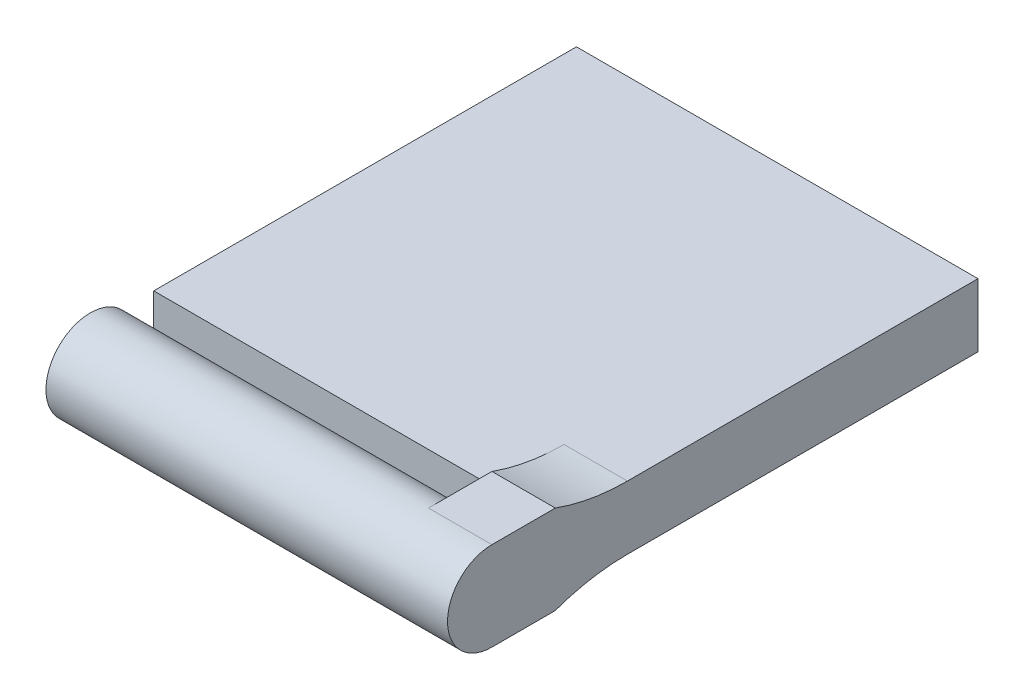
ISO-10303-21;
HEADER;
FILE_DESCRIPTION(('STEP AP214'),'2;1');
FILE_NAME('part.step','',(''),(''),'','','');
FILE_SCHEMA(('AUTOMOTIVE_DESIGN { 1 0 10303 214 1 1 1 1 }'));
ENDSEC;
DATA;
#1=APPLICATION_CONTEXT('core data for automotive mechanical design processes');
#2=APPLICATION_PROTOCOL_DEFINITION('international standard','automotive_design',2000,#1);
#3=PRODUCT_CONTEXT('',#1,'mechanical');
#4=PRODUCT('Part','Part','',(#3));
#5=PRODUCT_RELATED_PRODUCT_CATEGORY('part','',(#4));
#6=PRODUCT_DEFINITION_FORMATION('','',#4);
#7=PRODUCT_DEFINITION_CONTEXT('part definition',#1,'design');
#8=PRODUCT_DEFINITION('design','',#6,#7);
#9=PRODUCT_DEFINITION_SHAPE('','',#8);
#10=(LENGTH_UNIT() NAMED_UNIT(*) SI_UNIT(.MILLI.,.METRE.));
#11=(NAMED_UNIT(*) PLANE_ANGLE_UNIT() SI_UNIT($,.RADIAN.));
#12=(NAMED_UNIT(*) SI_UNIT($,.STERADIAN.) SOLID_ANGLE_UNIT());
#13=UNCERTAINTY_MEASURE_WITH_UNIT(LENGTH_MEASURE(1.E-05),#10,'distance_accuracy_value','');
#14=(GEOMETRIC_REPRESENTATION_CONTEXT(3) GLOBAL_UNCERTAINTY_ASSIGNED_CONTEXT((#13)) GLOBAL_UNIT_ASSIGNED_CONTEXT((#10,
#11,#12)) REPRESENTATION_CONTEXT('',''));
#15=CARTESIAN_POINT('',(0.,0.,0.));
#16=DIRECTION('',(0.,0.,1.));
#17=DIRECTION('',(1.,0.,0.));
#18=AXIS2_PLACEMENT_3D('',#15,#16,#17);
#19=CARTESIAN_POINT('',(16.,0.,0.));
#20=DIRECTION('',(-1.,0.,0.));
#21=DIRECTION('',(0.,0.,1.));
#22=AXIS2_PLACEMENT_3D('',#19,#20,#21);
#23=CYLINDRICAL_SURFACE('',#22,2.1);
#24=CARTESIAN_POINT('',(16.,0.,0.));
#25=DIRECTION('',(1.,0.,0.));
#26=DIRECTION('',(0.,0.,-1.));
#27=AXIS2_PLACEMENT_3D('',#24,#25,#26);
#28=CIRCLE('',#27,2.1);
#29=CARTESIAN_POINT('',(16.,-2.1,0.));
#30=VERTEX_POINT('',#29);
#31=CARTESIAN_POINT('',(16.,2.1,0.));
#32=VERTEX_POINT('',#31);
#33=EDGE_CURVE('E201',#30,#32,#28,.T.);
#34=ORIENTED_EDGE('',*,*,#33,.F.);
#35=DIRECTION('',(-1.,0.,0.));
#36=VECTOR('',#35,1.);
#37=CARTESIAN_POINT('',(19.,-2.1,0.));
#38=LINE('',#37,#36);
#39=CARTESIAN_POINT('',(19.,-2.1,0.));
#40=VERTEX_POINT('',#39);
#41=EDGE_CURVE('E196',#40,#30,#38,.T.);
#42=ORIENTED_EDGE('',*,*,#41,.F.);
#43=CARTESIAN_POINT('',(19.,0.,0.));
#44=DIRECTION('',(1.,0.,0.));
#45=DIRECTION('',(0.,0.,-1.));
#46=AXIS2_PLACEMENT_3D('',#43,#44,#45);
#47=CIRCLE('',#46,2.1);
#48=CARTESIAN_POINT('',(19.,2.1,0.));
#49=VERTEX_POINT('',#48);
#50=EDGE_CURVE('E165',#49,#40,#47,.T.);
#51=ORIENTED_EDGE('',*,*,#50,.F.);
#52=DIRECTION('',(-1.,0.,0.));
#53=VECTOR('',#52,1.);
#54=CARTESIAN_POINT('',(19.,2.1,0.));
#55=LINE('',#54,#53);
#56=EDGE_CURVE('E177',#49,#32,#55,.T.);
#57=ORIENTED_EDGE('',*,*,#56,.T.);
#58=EDGE_LOOP('',(#34,#42,#51,#57));
#59=FACE_BOUND('',#58,.T.);
#60=CARTESIAN_POINT('',(0.,0.,0.));
#61=DIRECTION('',(1.,0.,0.));
#62=DIRECTION('',(0.,0.,-1.));
#63=AXIS2_PLACEMENT_3D('',#60,#61,#62);
#64=CIRCLE('',#63,2.1);
#65=CARTESIAN_POINT('',(0.,0.,-2.1));
#66=VERTEX_POINT('',#65);
#67=EDGE_CURVE('E200',#66,#66,#64,.T.);
#68=ORIENTED_EDGE('',*,*,#67,.T.);
#69=EDGE_LOOP('',(#68));
#70=FACE_BOUND('',#69,.T.);
#71=ADVANCED_FACE('F41',(#59,#70),#23,.T.);
#72=CARTESIAN_POINT('',(0.,0.,0.));
#73=DIRECTION('',(1.,0.,0.));
#74=DIRECTION('',(0.,0.,-1.));
#75=AXIS2_PLACEMENT_3D('',#72,#73,#74);
#76=PLANE('',#75);
#77=ORIENTED_EDGE('',*,*,#67,.F.);
#78=EDGE_LOOP('',(#77));
#79=FACE_BOUND('',#78,.T.);
#80=ADVANCED_FACE('F253',(#79),#76,.F.);
#81=CARTESIAN_POINT('',(16.,0.,0.));
#82=DIRECTION('',(1.,0.,0.));
#83=DIRECTION('',(0.,0.,-1.));
#84=AXIS2_PLACEMENT_3D('',#81,#82,#83);
#85=PLANE('',#84);
#86=DIRECTION('',(0.,0.,1.));
#87=VECTOR('',#86,1.);
#88=CARTESIAN_POINT('',(16.,-2.1,0.));
#89=LINE('',#88,#87);
#90=CARTESIAN_POINT('',(16.,-2.1,-3.));
#91=VERTEX_POINT('',#90);
#92=EDGE_CURVE('E163',#91,#30,#89,.T.);
#93=ORIENTED_EDGE('',*,*,#92,.T.);
#94=ORIENTED_EDGE('',*,*,#33,.T.);
#95=DIRECTION('',(0.,0.,-1.));
#96=VECTOR('',#95,1.);
#97=CARTESIAN_POINT('',(16.,2.1,0.));
#98=LINE('',#97,#96);
#99=CARTESIAN_POINT('',(16.,2.1,-3.));
#100=VERTEX_POINT('',#99);
#101=EDGE_CURVE('E169',#32,#100,#98,.T.);
#102=ORIENTED_EDGE('',*,*,#101,.T.);
#103=CARTESIAN_POINT('',(16.,11.5,-6.4117444218464));
#104=DIRECTION('',(1.,0.,0.));
#105=DIRECTION('',(0.,0.,-1.));
#106=AXIS2_PLACEMENT_3D('',#103,#104,#105);
#107=CIRCLE('',#106,10.);
#108=CARTESIAN_POINT('',(16.,1.5,-6.4117444218464));
#109=VERTEX_POINT('',#108);
#110=EDGE_CURVE('E11',#100,#109,#107,.T.);
#111=ORIENTED_EDGE('',*,*,#110,.T.);
#112=DIRECTION('',(0.,0.,-1.));
#113=VECTOR('',#112,1.);
#114=CARTESIAN_POINT('',(16.,1.5,-3.));
#115=LINE('',#114,#113);
#116=CARTESIAN_POINT('',(16.,1.5,-3.));
#117=VERTEX_POINT('',#116);
#118=EDGE_CURVE('E56',#117,#109,#115,.T.);
#119=ORIENTED_EDGE('',*,*,#118,.F.);
#120=DIRECTION('',(0.,-1.,0.));
#121=VECTOR('',#120,1.);
#122=CARTESIAN_POINT('',(16.,0.,-3.));
#123=LINE('',#122,#121);
#124=CARTESIAN_POINT('',(16.,-1.5,-3.));
#125=VERTEX_POINT('',#124);
#126=EDGE_CURVE('E181',#117,#125,#123,.T.);
#127=ORIENTED_EDGE('',*,*,#126,.T.);
#128=DIRECTION('',(0.,0.,1.));
#129=VECTOR('',#128,1.);
#130=CARTESIAN_POINT('',(16.,-1.5,-3.));
#131=LINE('',#130,#129);
#132=CARTESIAN_POINT('',(16.,-1.5,-6.4117444218464));
#133=VERTEX_POINT('',#132);
#134=EDGE_CURVE('E204',#133,#125,#131,.T.);
#135=ORIENTED_EDGE('',*,*,#134,.F.);
#136=CARTESIAN_POINT('',(16.,-11.5,-6.4117444218464));
#137=DIRECTION('',(1.,0.,0.));
#138=DIRECTION('',(0.,0.,-1.));
#139=AXIS2_PLACEMENT_3D('',#136,#137,#138);
#140=CIRCLE('',#139,10.);
#141=EDGE_CURVE('E221',#133,#91,#140,.T.);
#142=ORIENTED_EDGE('',*,*,#141,.T.);
#143=EDGE_LOOP('',(#93,#94,#102,#111,#119,#127,#135,#142));
#144=FACE_BOUND('',#143,.T.);
#145=ADVANCED_FACE('F241',(#144),#85,.F.);
#146=CARTESIAN_POINT('',(19.,-2.1,0.));
#147=DIRECTION('',(0.,-1.,0.));
#148=DIRECTION('',(0.,0.,-1.));
#149=AXIS2_PLACEMENT_3D('',#146,#147,#148);
#150=PLANE('',#149);
#151=ORIENTED_EDGE('',*,*,#92,.F.);
#152=DIRECTION('',(-1.,0.,0.));
#153=VECTOR('',#152,1.);
#154=CARTESIAN_POINT('',(19.,-2.1,-3.));
#155=LINE('',#154,#153);
#156=CARTESIAN_POINT('',(19.,-2.1,-3.));
#157=VERTEX_POINT('',#156);
#158=EDGE_CURVE('E192',#157,#91,#155,.T.);
#159=ORIENTED_EDGE('',*,*,#158,.F.);
#160=DIRECTION('',(0.,0.,1.));
#161=VECTOR('',#160,1.);
#162=CARTESIAN_POINT('',(19.,-2.1,0.));
#163=LINE('',#162,#161);
#164=EDGE_CURVE('E168',#157,#40,#163,.T.);
#165=ORIENTED_EDGE('',*,*,#164,.T.);
#166=ORIENTED_EDGE('',*,*,#41,.T.);
#167=EDGE_LOOP('',(#151,#159,#165,#166));
#168=FACE_BOUND('',#167,.T.);
#169=ADVANCED_FACE('F248',(#168),#150,.T.);
#170=CARTESIAN_POINT('',(19.,2.1,0.));
#171=DIRECTION('',(0.,1.,0.));
#172=DIRECTION('',(0.,0.,1.));
#173=AXIS2_PLACEMENT_3D('',#170,#171,#172);
#174=PLANE('',#173);
#175=ORIENTED_EDGE('',*,*,#101,.F.);
#176=ORIENTED_EDGE('',*,*,#56,.F.);
#177=DIRECTION('',(0.,0.,-1.));
#178=VECTOR('',#177,1.);
#179=CARTESIAN_POINT('',(19.,2.1,0.));
#180=LINE('',#179,#178);
#181=CARTESIAN_POINT('',(19.,2.1,-3.));
#182=VERTEX_POINT('',#181);
#183=EDGE_CURVE('E173',#49,#182,#180,.T.);
#184=ORIENTED_EDGE('',*,*,#183,.T.);
#185=DIRECTION('',(-1.,0.,0.));
#186=VECTOR('',#185,1.);
#187=CARTESIAN_POINT('',(19.,2.1,-3.));
#188=LINE('',#187,#186);
#189=EDGE_CURVE('E189',#182,#100,#188,.T.);
#190=ORIENTED_EDGE('',*,*,#189,.T.);
#191=EDGE_LOOP('',(#175,#176,#184,#190));
#192=FACE_BOUND('',#191,.T.);
#193=ADVANCED_FACE('F230',(#192),#174,.T.);
#194=CARTESIAN_POINT('',(19.,0.,0.));
#195=DIRECTION('',(1.,0.,0.));
#196=DIRECTION('',(0.,0.,-1.));
#197=AXIS2_PLACEMENT_3D('',#194,#195,#196);
#198=PLANE('',#197);
#199=ORIENTED_EDGE('',*,*,#50,.T.);
#200=ORIENTED_EDGE('',*,*,#164,.F.);
#201=CARTESIAN_POINT('',(19.,-11.5,-6.4117444218464));
#202=DIRECTION('',(1.,0.,0.));
#203=DIRECTION('',(0.,0.,-1.));
#204=AXIS2_PLACEMENT_3D('',#201,#202,#203);
#205=CIRCLE('',#204,10.);
#206=CARTESIAN_POINT('',(19.,-1.5,-6.4117444218464));
#207=VERTEX_POINT('',#206);
#208=EDGE_CURVE('E125',#157,#207,#205,.F.);
#209=ORIENTED_EDGE('',*,*,#208,.T.);
#210=DIRECTION('',(0.,0.,-1.));
#211=VECTOR('',#210,1.);
#212=CARTESIAN_POINT('',(19.,-1.5,-3.));
#213=LINE('',#212,#211);
#214=CARTESIAN_POINT('',(19.,-1.5,-23.));
#215=VERTEX_POINT('',#214);
#216=EDGE_CURVE('E117',#207,#215,#213,.T.);
#217=ORIENTED_EDGE('',*,*,#216,.T.);
#218=DIRECTION('',(0.,1.,0.));
#219=VECTOR('',#218,1.);
#220=CARTESIAN_POINT('',(19.,1.5,-23.));
#221=LINE('',#220,#219);
#222=CARTESIAN_POINT('',(19.,1.5,-23.));
#223=VERTEX_POINT('',#222);
#224=EDGE_CURVE('E122',#215,#223,#221,.T.);
#225=ORIENTED_EDGE('',*,*,#224,.T.);
#226=DIRECTION('',(0.,0.,1.));
#227=VECTOR('',#226,1.);
#228=CARTESIAN_POINT('',(19.,1.5,-3.));
#229=LINE('',#228,#227);
#230=CARTESIAN_POINT('',(19.,1.5,-6.4117444218464));
#231=VERTEX_POINT('',#230);
#232=EDGE_CURVE('E146',#223,#231,#229,.T.);
#233=ORIENTED_EDGE('',*,*,#232,.T.);
#234=CARTESIAN_POINT('',(19.,11.5,-6.4117444218464));
#235=DIRECTION('',(1.,0.,0.));
#236=DIRECTION('',(0.,0.,-1.));
#237=AXIS2_PLACEMENT_3D('',#234,#235,#236);
#238=CIRCLE('',#237,10.);
#239=EDGE_CURVE('E50',#231,#182,#238,.F.);
#240=ORIENTED_EDGE('',*,*,#239,.T.);
#241=ORIENTED_EDGE('',*,*,#183,.F.);
#242=EDGE_LOOP('',(#199,#200,#209,#217,#225,#233,#240,#241));
#243=FACE_BOUND('',#242,.T.);
#244=ADVANCED_FACE('F119',(#243),#198,.T.);
#245=CARTESIAN_POINT('',(-20.2237484161567,1.5,-3.));
#246=DIRECTION('',(0.,0.,1.));
#247=DIRECTION('',(1.,0.,0.));
#248=AXIS2_PLACEMENT_3D('',#245,#246,#247);
#249=PLANE('',#248);
#250=ORIENTED_EDGE('',*,*,#126,.F.);
#251=DIRECTION('',(1.,0.,0.));
#252=VECTOR('',#251,1.);
#253=CARTESIAN_POINT('',(-20.2237484161567,1.5,-3.));
#254=LINE('',#253,#252);
#255=CARTESIAN_POINT('',(0.,1.5,-3.));
#256=VERTEX_POINT('',#255);
#257=EDGE_CURVE('E152',#256,#117,#254,.T.);
#258=ORIENTED_EDGE('',*,*,#257,.F.);
#259=DIRECTION('',(0.,1.,0.));
#260=VECTOR('',#259,1.);
#261=CARTESIAN_POINT('',(0.,1.5,-3.));
#262=LINE('',#261,#260);
#263=CARTESIAN_POINT('',(0.,-1.5,-3.));
#264=VERTEX_POINT('',#263);
#265=EDGE_CURVE('E164',#264,#256,#262,.T.);
#266=ORIENTED_EDGE('',*,*,#265,.F.);
#267=DIRECTION('',(1.,0.,0.));
#268=VECTOR('',#267,1.);
#269=CARTESIAN_POINT('',(-20.2237484161567,-1.5,-3.));
#270=LINE('',#269,#268);
#271=EDGE_CURVE('E141',#264,#125,#270,.T.);
#272=ORIENTED_EDGE('',*,*,#271,.T.);
#273=EDGE_LOOP('',(#250,#258,#266,#272));
#274=FACE_BOUND('',#273,.T.);
#275=ADVANCED_FACE('F240',(#274),#249,.T.);
#276=CARTESIAN_POINT('',(-20.2237484161567,1.5,-3.));
#277=DIRECTION('',(0.,1.,0.));
#278=DIRECTION('',(0.,0.,1.));
#279=AXIS2_PLACEMENT_3D('',#276,#277,#278);
#280=PLANE('',#279);
#281=ORIENTED_EDGE('',*,*,#118,.T.);
#282=DIRECTION('',(-1.,0.,0.));
#283=VECTOR('',#282,1.);
#284=CARTESIAN_POINT('',(19.,1.5,-6.4117444218464));
#285=LINE('',#284,#283);
#286=EDGE_CURVE('E215',#109,#231,#285,.F.);
#287=ORIENTED_EDGE('',*,*,#286,.T.);
#288=ORIENTED_EDGE('',*,*,#232,.F.);
#289=DIRECTION('',(1.,0.,0.));
#290=VECTOR('',#289,1.);
#291=CARTESIAN_POINT('',(-20.2237484161567,1.5,-23.));
#292=LINE('',#291,#290);
#293=CARTESIAN_POINT('',(0.,1.5,-23.));
#294=VERTEX_POINT('',#293);
#295=EDGE_CURVE('E140',#294,#223,#292,.T.);
#296=ORIENTED_EDGE('',*,*,#295,.F.);
#297=DIRECTION('',(0.,0.,-1.));
#298=VECTOR('',#297,1.);
#299=CARTESIAN_POINT('',(0.,1.5,-3.));
#300=LINE('',#299,#298);
#301=EDGE_CURVE('E237',#256,#294,#300,.T.);
#302=ORIENTED_EDGE('',*,*,#301,.F.);
#303=ORIENTED_EDGE('',*,*,#257,.T.);
#304=EDGE_LOOP('',(#281,#287,#288,#296,#302,#303));
#305=FACE_BOUND('',#304,.T.);
#306=ADVANCED_FACE('F233',(#305),#280,.T.);
#307=CARTESIAN_POINT('',(-20.2237484161567,1.5,-23.));
#308=DIRECTION('',(0.,0.,-1.));
#309=DIRECTION('',(-1.,0.,0.));
#310=AXIS2_PLACEMENT_3D('',#307,#308,#309);
#311=PLANE('',#310);
#312=DIRECTION('',(0.,-1.,0.));
#313=VECTOR('',#312,1.);
#314=CARTESIAN_POINT('',(0.,1.5,-23.));
#315=LINE('',#314,#313);
#316=CARTESIAN_POINT('',(0.,-1.5,-23.));
#317=VERTEX_POINT('',#316);
#318=EDGE_CURVE('E155',#294,#317,#315,.T.);
#319=ORIENTED_EDGE('',*,*,#318,.F.);
#320=ORIENTED_EDGE('',*,*,#295,.T.);
#321=ORIENTED_EDGE('',*,*,#224,.F.);
#322=DIRECTION('',(1.,0.,0.));
#323=VECTOR('',#322,1.);
#324=CARTESIAN_POINT('',(-20.2237484161567,-1.5,-23.));
#325=LINE('',#324,#323);
#326=EDGE_CURVE('E133',#317,#215,#325,.T.);
#327=ORIENTED_EDGE('',*,*,#326,.F.);
#328=EDGE_LOOP('',(#319,#320,#321,#327));
#329=FACE_BOUND('',#328,.T.);
#330=ADVANCED_FACE('F143',(#329),#311,.T.);
#331=CARTESIAN_POINT('',(-20.2237484161567,-1.5,-3.));
#332=DIRECTION('',(0.,-1.,0.));
#333=DIRECTION('',(0.,0.,-1.));
#334=AXIS2_PLACEMENT_3D('',#331,#332,#333);
#335=PLANE('',#334);
#336=ORIENTED_EDGE('',*,*,#216,.F.);
#337=DIRECTION('',(1.,0.,0.));
#338=VECTOR('',#337,1.);
#339=CARTESIAN_POINT('',(16.,-1.5,-6.4117444218464));
#340=LINE('',#339,#338);
#341=EDGE_CURVE('E210',#207,#133,#340,.F.);
#342=ORIENTED_EDGE('',*,*,#341,.T.);
#343=ORIENTED_EDGE('',*,*,#134,.T.);
#344=ORIENTED_EDGE('',*,*,#271,.F.);
#345=DIRECTION('',(0.,0.,1.));
#346=VECTOR('',#345,1.);
#347=CARTESIAN_POINT('',(0.,-1.5,-3.));
#348=LINE('',#347,#346);
#349=EDGE_CURVE('E136',#317,#264,#348,.T.);
#350=ORIENTED_EDGE('',*,*,#349,.F.);
#351=ORIENTED_EDGE('',*,*,#326,.T.);
#352=EDGE_LOOP('',(#336,#342,#343,#344,#350,#351));
#353=FACE_BOUND('',#352,.T.);
#354=ADVANCED_FACE('F134',(#353),#335,.T.);
#355=CARTESIAN_POINT('',(0.,0.,0.));
#356=DIRECTION('',(1.,0.,0.));
#357=DIRECTION('',(0.,0.,-1.));
#358=AXIS2_PLACEMENT_3D('',#355,#356,#357);
#359=PLANE('',#358);
#360=ORIENTED_EDGE('',*,*,#265,.T.);
#361=ORIENTED_EDGE('',*,*,#301,.T.);
#362=ORIENTED_EDGE('',*,*,#318,.T.);
#363=ORIENTED_EDGE('',*,*,#349,.T.);
#364=EDGE_LOOP('',(#360,#361,#362,#363));
#365=FACE_BOUND('',#364,.T.);
#366=ADVANCED_FACE('F266',(#365),#359,.F.);
#367=CARTESIAN_POINT('',(19.,-11.5,-6.4117444218464));
#368=DIRECTION('',(-1.,0.,0.));
#369=DIRECTION('',(0.,0.,1.));
#370=AXIS2_PLACEMENT_3D('',#367,#368,#369);
#371=CYLINDRICAL_SURFACE('',#370,10.);
#372=ORIENTED_EDGE('',*,*,#141,.F.);
#373=ORIENTED_EDGE('',*,*,#341,.F.);
#374=ORIENTED_EDGE('',*,*,#208,.F.);
#375=ORIENTED_EDGE('',*,*,#158,.T.);
#376=EDGE_LOOP('',(#372,#373,#374,#375));
#377=FACE_BOUND('',#376,.T.);
#378=ADVANCED_FACE('F245',(#377),#371,.F.);
#379=CARTESIAN_POINT('',(19.,11.5,-6.4117444218464));
#380=DIRECTION('',(1.,0.,0.));
#381=DIRECTION('',(0.,0.,-1.));
#382=AXIS2_PLACEMENT_3D('',#379,#380,#381);
#383=CYLINDRICAL_SURFACE('',#382,10.);
#384=ORIENTED_EDGE('',*,*,#110,.F.);
#385=ORIENTED_EDGE('',*,*,#189,.F.);
#386=ORIENTED_EDGE('',*,*,#239,.F.);
#387=ORIENTED_EDGE('',*,*,#286,.F.);
#388=EDGE_LOOP('',(#384,#385,#386,#387));
#389=FACE_BOUND('',#388,.T.);
#390=ADVANCED_FACE('F43',(#389),#383,.F.);
#391=CLOSED_SHELL('',(#71,#80,#145,#169,#193,#244,#275,#306,#330,#354,#366,#378,#390));
#392=MANIFOLD_SOLID_BREP('B2',#391);
#393=ADVANCED_BREP_SHAPE_REPRESENTATION('',(#18,#392),#14);
#394=SHAPE_DEFINITION_REPRESENTATION(#9,#393);
ENDSEC;
END-ISO-10303-21;
